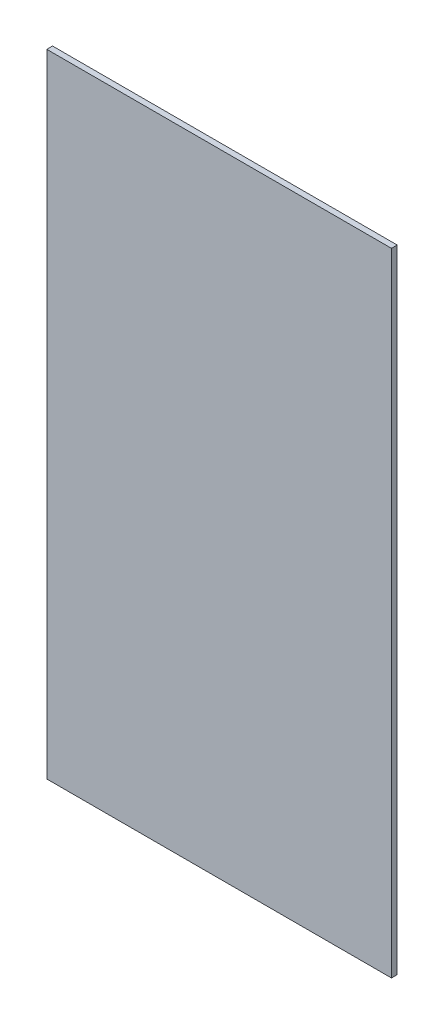
ISO-10303-21;
HEADER;
FILE_DESCRIPTION(('STEP AP214'),'2;1');
FILE_NAME('part.step','',(''),(''),'','','');
FILE_SCHEMA(('AUTOMOTIVE_DESIGN { 1 0 10303 214 1 1 1 1 }'));
ENDSEC;
DATA;
#1=APPLICATION_CONTEXT('core data for automotive mechanical design processes');
#2=APPLICATION_PROTOCOL_DEFINITION('international standard','automotive_design',2000,#1);
#3=PRODUCT_CONTEXT('',#1,'mechanical');
#4=PRODUCT('Part','Part','',(#3));
#5=PRODUCT_RELATED_PRODUCT_CATEGORY('part','',(#4));
#6=PRODUCT_DEFINITION_FORMATION('','',#4);
#7=PRODUCT_DEFINITION_CONTEXT('part definition',#1,'design');
#8=PRODUCT_DEFINITION('design','',#6,#7);
#9=PRODUCT_DEFINITION_SHAPE('','',#8);
#10=(LENGTH_UNIT() NAMED_UNIT(*) SI_UNIT(.MILLI.,.METRE.));
#11=(NAMED_UNIT(*) PLANE_ANGLE_UNIT() SI_UNIT($,.RADIAN.));
#12=(NAMED_UNIT(*) SI_UNIT($,.STERADIAN.) SOLID_ANGLE_UNIT());
#13=UNCERTAINTY_MEASURE_WITH_UNIT(LENGTH_MEASURE(1.E-05),#10,'distance_accuracy_value','');
#14=(GEOMETRIC_REPRESENTATION_CONTEXT(3) GLOBAL_UNCERTAINTY_ASSIGNED_CONTEXT((#13)) GLOBAL_UNIT_ASSIGNED_CONTEXT((#10,
#11,#12)) REPRESENTATION_CONTEXT('',''));
#15=CARTESIAN_POINT('',(0.,0.,0.));
#16=DIRECTION('',(0.,0.,1.));
#17=DIRECTION('',(1.,0.,0.));
#18=AXIS2_PLACEMENT_3D('',#15,#16,#17);
#19=CARTESIAN_POINT('',(0.,0.,1.));
#20=DIRECTION('',(1.,0.,0.));
#21=DIRECTION('',(0.,1.,0.));
#22=AXIS2_PLACEMENT_3D('',#19,#20,#21);
#23=PLANE('',#22);
#24=DIRECTION('',(0.,-1.,0.));
#25=VECTOR('',#24,1.);
#26=CARTESIAN_POINT('',(0.,0.,0.));
#27=LINE('',#26,#25);
#28=CARTESIAN_POINT('',(0.,110.,0.));
#29=VERTEX_POINT('',#28);
#30=CARTESIAN_POINT('',(0.,0.,0.));
#31=VERTEX_POINT('',#30);
#32=EDGE_CURVE('E96',#29,#31,#27,.T.);
#33=ORIENTED_EDGE('',*,*,#32,.T.);
#34=DIRECTION('',(0.,0.,-1.));
#35=VECTOR('',#34,1.);
#36=CARTESIAN_POINT('',(0.,0.,1.));
#37=LINE('',#36,#35);
#38=CARTESIAN_POINT('',(0.,0.,1.));
#39=VERTEX_POINT('',#38);
#40=EDGE_CURVE('E11',#39,#31,#37,.T.);
#41=ORIENTED_EDGE('',*,*,#40,.F.);
#42=DIRECTION('',(0.,-1.,0.));
#43=VECTOR('',#42,1.);
#44=CARTESIAN_POINT('',(0.,0.,1.));
#45=LINE('',#44,#43);
#46=CARTESIAN_POINT('',(0.,110.,1.));
#47=VERTEX_POINT('',#46);
#48=EDGE_CURVE('E84',#47,#39,#45,.T.);
#49=ORIENTED_EDGE('',*,*,#48,.F.);
#50=DIRECTION('',(0.,0.,-1.));
#51=VECTOR('',#50,1.);
#52=CARTESIAN_POINT('',(0.,110.,1.));
#53=LINE('',#52,#51);
#54=EDGE_CURVE('E92',#47,#29,#53,.T.);
#55=ORIENTED_EDGE('',*,*,#54,.T.);
#56=EDGE_LOOP('',(#33,#41,#49,#55));
#57=FACE_BOUND('',#56,.T.);
#58=ADVANCED_FACE('F33',(#57),#23,.F.);
#59=CARTESIAN_POINT('',(0.,0.,1.));
#60=DIRECTION('',(0.,1.,0.));
#61=DIRECTION('',(0.,0.,1.));
#62=AXIS2_PLACEMENT_3D('',#59,#60,#61);
#63=PLANE('',#62);
#64=DIRECTION('',(1.,0.,0.));
#65=VECTOR('',#64,1.);
#66=CARTESIAN_POINT('',(0.,0.,0.));
#67=LINE('',#66,#65);
#68=CARTESIAN_POINT('',(60.,0.,0.));
#69=VERTEX_POINT('',#68);
#70=EDGE_CURVE('E88',#31,#69,#67,.T.);
#71=ORIENTED_EDGE('',*,*,#70,.T.);
#72=DIRECTION('',(0.,0.,-1.));
#73=VECTOR('',#72,1.);
#74=CARTESIAN_POINT('',(60.,0.,1.));
#75=LINE('',#74,#73);
#76=CARTESIAN_POINT('',(60.,0.,1.));
#77=VERTEX_POINT('',#76);
#78=EDGE_CURVE('E41',#77,#69,#75,.T.);
#79=ORIENTED_EDGE('',*,*,#78,.F.);
#80=DIRECTION('',(1.,0.,0.));
#81=VECTOR('',#80,1.);
#82=CARTESIAN_POINT('',(0.,0.,1.));
#83=LINE('',#82,#81);
#84=EDGE_CURVE('E79',#39,#77,#83,.T.);
#85=ORIENTED_EDGE('',*,*,#84,.F.);
#86=ORIENTED_EDGE('',*,*,#40,.T.);
#87=EDGE_LOOP('',(#71,#79,#85,#86));
#88=FACE_BOUND('',#87,.T.);
#89=ADVANCED_FACE('F87',(#88),#63,.F.);
#90=CARTESIAN_POINT('',(60.,0.,1.));
#91=DIRECTION('',(-1.,0.,0.));
#92=DIRECTION('',(0.,-1.,0.));
#93=AXIS2_PLACEMENT_3D('',#90,#91,#92);
#94=PLANE('',#93);
#95=DIRECTION('',(0.,1.,0.));
#96=VECTOR('',#95,1.);
#97=CARTESIAN_POINT('',(60.,0.,0.));
#98=LINE('',#97,#96);
#99=CARTESIAN_POINT('',(60.,110.,0.));
#100=VERTEX_POINT('',#99);
#101=EDGE_CURVE('E66',#69,#100,#98,.T.);
#102=ORIENTED_EDGE('',*,*,#101,.T.);
#103=DIRECTION('',(0.,0.,-1.));
#104=VECTOR('',#103,1.);
#105=CARTESIAN_POINT('',(60.,110.,1.));
#106=LINE('',#105,#104);
#107=CARTESIAN_POINT('',(60.,110.,1.));
#108=VERTEX_POINT('',#107);
#109=EDGE_CURVE('E89',#108,#100,#106,.T.);
#110=ORIENTED_EDGE('',*,*,#109,.F.);
#111=DIRECTION('',(0.,1.,0.));
#112=VECTOR('',#111,1.);
#113=CARTESIAN_POINT('',(60.,0.,1.));
#114=LINE('',#113,#112);
#115=EDGE_CURVE('E82',#77,#108,#114,.T.);
#116=ORIENTED_EDGE('',*,*,#115,.F.);
#117=ORIENTED_EDGE('',*,*,#78,.T.);
#118=EDGE_LOOP('',(#102,#110,#116,#117));
#119=FACE_BOUND('',#118,.T.);
#120=ADVANCED_FACE('F90',(#119),#94,.F.);
#121=CARTESIAN_POINT('',(0.,110.,1.));
#122=DIRECTION('',(0.,-1.,0.));
#123=DIRECTION('',(0.,0.,-1.));
#124=AXIS2_PLACEMENT_3D('',#121,#122,#123);
#125=PLANE('',#124);
#126=DIRECTION('',(-1.,0.,0.));
#127=VECTOR('',#126,1.);
#128=CARTESIAN_POINT('',(0.,110.,0.));
#129=LINE('',#128,#127);
#130=EDGE_CURVE('E72',#100,#29,#129,.T.);
#131=ORIENTED_EDGE('',*,*,#130,.T.);
#132=ORIENTED_EDGE('',*,*,#54,.F.);
#133=DIRECTION('',(-1.,0.,0.));
#134=VECTOR('',#133,1.);
#135=CARTESIAN_POINT('',(0.,110.,1.));
#136=LINE('',#135,#134);
#137=EDGE_CURVE('E49',#108,#47,#136,.T.);
#138=ORIENTED_EDGE('',*,*,#137,.F.);
#139=ORIENTED_EDGE('',*,*,#109,.T.);
#140=EDGE_LOOP('',(#131,#132,#138,#139));
#141=FACE_BOUND('',#140,.T.);
#142=ADVANCED_FACE('F103',(#141),#125,.F.);
#143=CARTESIAN_POINT('',(0.,0.,1.));
#144=DIRECTION('',(0.,0.,-1.));
#145=DIRECTION('',(-1.,0.,0.));
#146=AXIS2_PLACEMENT_3D('',#143,#144,#145);
#147=PLANE('',#146);
#148=ORIENTED_EDGE('',*,*,#48,.T.);
#149=ORIENTED_EDGE('',*,*,#84,.T.);
#150=ORIENTED_EDGE('',*,*,#115,.T.);
#151=ORIENTED_EDGE('',*,*,#137,.T.);
#152=EDGE_LOOP('',(#148,#149,#150,#151));
#153=FACE_BOUND('',#152,.T.);
#154=ADVANCED_FACE('F80',(#153),#147,.F.);
#155=CARTESIAN_POINT('',(0.,0.,0.));
#156=DIRECTION('',(0.,0.,-1.));
#157=DIRECTION('',(-1.,0.,0.));
#158=AXIS2_PLACEMENT_3D('',#155,#156,#157);
#159=PLANE('',#158);
#160=ORIENTED_EDGE('',*,*,#32,.F.);
#161=ORIENTED_EDGE('',*,*,#130,.F.);
#162=ORIENTED_EDGE('',*,*,#101,.F.);
#163=ORIENTED_EDGE('',*,*,#70,.F.);
#164=EDGE_LOOP('',(#160,#161,#162,#163));
#165=FACE_BOUND('',#164,.T.);
#166=ADVANCED_FACE('F106',(#165),#159,.T.);
#167=CLOSED_SHELL('',(#58,#89,#120,#142,#154,#166));
#168=MANIFOLD_SOLID_BREP('B2',#167);
#169=ADVANCED_BREP_SHAPE_REPRESENTATION('',(#18,#168),#14);
#170=SHAPE_DEFINITION_REPRESENTATION(#9,#169);
ENDSEC;
END-ISO-10303-21;
